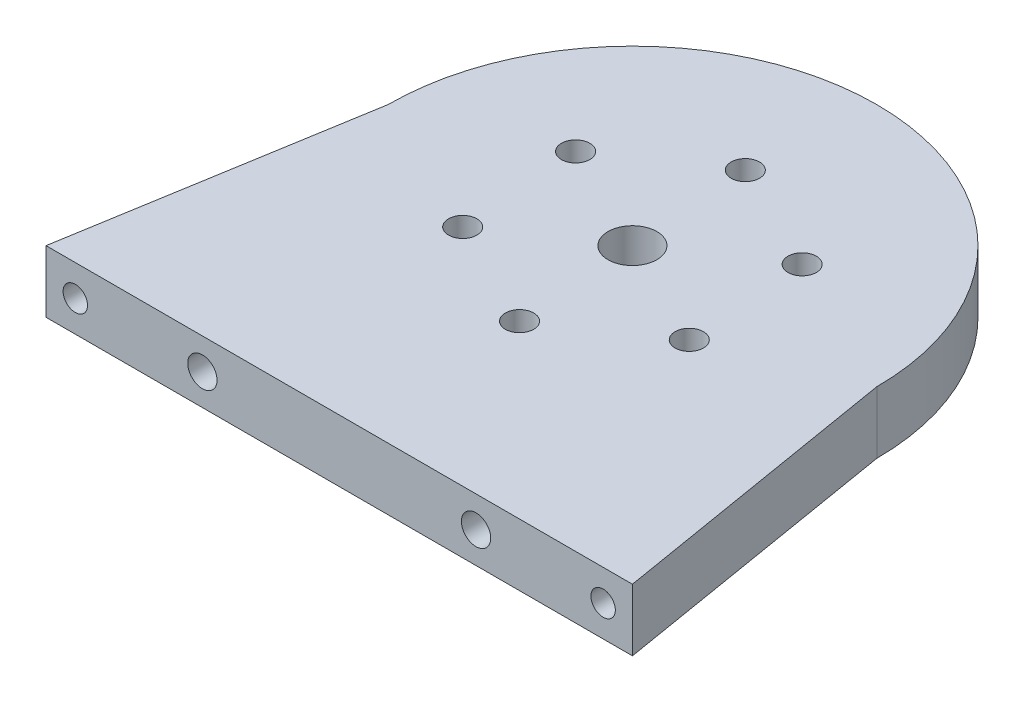
ISO-10303-21;
HEADER;
FILE_DESCRIPTION(('STEP AP214'),'2;1');
FILE_NAME('part.step','',(''),(''),'','','');
FILE_SCHEMA(('AUTOMOTIVE_DESIGN { 1 0 10303 214 1 1 1 1 }'));
ENDSEC;
DATA;
#1=APPLICATION_CONTEXT('core data for automotive mechanical design processes');
#2=APPLICATION_PROTOCOL_DEFINITION('international standard','automotive_design',2000,#1);
#3=PRODUCT_CONTEXT('',#1,'mechanical');
#4=PRODUCT('Part','Part','',(#3));
#5=PRODUCT_RELATED_PRODUCT_CATEGORY('part','',(#4));
#6=PRODUCT_DEFINITION_FORMATION('','',#4);
#7=PRODUCT_DEFINITION_CONTEXT('part definition',#1,'design');
#8=PRODUCT_DEFINITION('design','',#6,#7);
#9=PRODUCT_DEFINITION_SHAPE('','',#8);
#10=(LENGTH_UNIT() NAMED_UNIT(*) SI_UNIT(.MILLI.,.METRE.));
#11=(NAMED_UNIT(*) PLANE_ANGLE_UNIT() SI_UNIT($,.RADIAN.));
#12=(NAMED_UNIT(*) SI_UNIT($,.STERADIAN.) SOLID_ANGLE_UNIT());
#13=UNCERTAINTY_MEASURE_WITH_UNIT(LENGTH_MEASURE(1.E-05),#10,'distance_accuracy_value','');
#14=(GEOMETRIC_REPRESENTATION_CONTEXT(3) GLOBAL_UNCERTAINTY_ASSIGNED_CONTEXT((#13)) GLOBAL_UNIT_ASSIGNED_CONTEXT((#10,
#11,#12)) REPRESENTATION_CONTEXT('',''));
#15=CARTESIAN_POINT('',(0.,0.,0.));
#16=DIRECTION('',(0.,0.,1.));
#17=DIRECTION('',(1.,0.,0.));
#18=AXIS2_PLACEMENT_3D('',#15,#16,#17);
#19=CARTESIAN_POINT('',(122.4,3.175,366.55));
#20=DIRECTION('',(0.986393923832144,0.,0.164398987305357));
#21=DIRECTION('',(0.164398987305357,0.,-0.986393923832144));
#22=AXIS2_PLACEMENT_3D('',#19,#20,#21);
#23=PLANE('',#22);
#24=DIRECTION('',(-0.164398987305357,0.,0.986393923832144));
#25=VECTOR('',#24,1.);
#26=CARTESIAN_POINT('',(122.4,-3.175,366.55));
#27=LINE('',#26,#25);
#28=CARTESIAN_POINT('',(127.4,-3.175,336.55));
#29=VERTEX_POINT('',#28);
#30=CARTESIAN_POINT('',(122.4,-3.175,366.55));
#31=VERTEX_POINT('',#30);
#32=EDGE_CURVE('E115',#29,#31,#27,.T.);
#33=ORIENTED_EDGE('',*,*,#32,.T.);
#34=DIRECTION('',(0.,-1.,0.));
#35=VECTOR('',#34,1.);
#36=CARTESIAN_POINT('',(122.4,3.175,366.55));
#37=LINE('',#36,#35);
#38=CARTESIAN_POINT('',(122.4,3.175,366.55));
#39=VERTEX_POINT('',#38);
#40=EDGE_CURVE('E11',#39,#31,#37,.T.);
#41=ORIENTED_EDGE('',*,*,#40,.F.);
#42=DIRECTION('',(-0.164398987305357,0.,0.986393923832144));
#43=VECTOR('',#42,1.);
#44=CARTESIAN_POINT('',(122.4,3.175,366.55));
#45=LINE('',#44,#43);
#46=CARTESIAN_POINT('',(127.4,3.175,336.55));
#47=VERTEX_POINT('',#46);
#48=EDGE_CURVE('E65',#47,#39,#45,.T.);
#49=ORIENTED_EDGE('',*,*,#48,.F.);
#50=DIRECTION('',(0.,-1.,0.));
#51=VECTOR('',#50,1.);
#52=CARTESIAN_POINT('',(127.4,3.175,336.55));
#53=LINE('',#52,#51);
#54=EDGE_CURVE('E84',#47,#29,#53,.T.);
#55=ORIENTED_EDGE('',*,*,#54,.T.);
#56=EDGE_LOOP('',(#33,#41,#49,#55));
#57=FACE_BOUND('',#56,.T.);
#58=ADVANCED_FACE('F44',(#57),#23,.F.);
#59=CARTESIAN_POINT('',(182.4,3.175,366.55));
#60=DIRECTION('',(0.,0.,-1.));
#61=DIRECTION('',(-1.,0.,0.));
#62=AXIS2_PLACEMENT_3D('',#59,#60,#61);
#63=PLANE('',#62);
#64=CARTESIAN_POINT('',(138.4,0.,366.55));
#65=DIRECTION('',(0.,0.,1.));
#66=DIRECTION('',(1.,0.,0.));
#67=AXIS2_PLACEMENT_3D('',#64,#65,#66);
#68=CIRCLE('',#67,1.5);
#69=CARTESIAN_POINT('',(139.9,0.,366.55));
#70=VERTEX_POINT('',#69);
#71=EDGE_CURVE('E249',#70,#70,#68,.T.);
#72=ORIENTED_EDGE('',*,*,#71,.F.);
#73=EDGE_LOOP('',(#72));
#74=FACE_BOUND('',#73,.T.);
#75=CARTESIAN_POINT('',(166.4,0.,366.55));
#76=DIRECTION('',(0.,0.,1.));
#77=DIRECTION('',(1.,0.,0.));
#78=AXIS2_PLACEMENT_3D('',#75,#76,#77);
#79=CIRCLE('',#78,1.5);
#80=CARTESIAN_POINT('',(167.9,0.,366.55));
#81=VERTEX_POINT('',#80);
#82=EDGE_CURVE('E263',#81,#81,#79,.T.);
#83=ORIENTED_EDGE('',*,*,#82,.F.);
#84=EDGE_LOOP('',(#83));
#85=FACE_BOUND('',#84,.T.);
#86=CARTESIAN_POINT('',(125.4,0.,366.55));
#87=DIRECTION('',(0.,0.,1.));
#88=DIRECTION('',(1.,0.,0.));
#89=AXIS2_PLACEMENT_3D('',#86,#87,#88);
#90=CIRCLE('',#89,1.25);
#91=CARTESIAN_POINT('',(126.65,0.,366.55));
#92=VERTEX_POINT('',#91);
#93=EDGE_CURVE('E208',#92,#92,#90,.T.);
#94=ORIENTED_EDGE('',*,*,#93,.F.);
#95=EDGE_LOOP('',(#94));
#96=FACE_BOUND('',#95,.T.);
#97=CARTESIAN_POINT('',(179.4,0.,366.55));
#98=DIRECTION('',(0.,0.,1.));
#99=DIRECTION('',(1.,0.,0.));
#100=AXIS2_PLACEMENT_3D('',#97,#98,#99);
#101=CIRCLE('',#100,1.25);
#102=CARTESIAN_POINT('',(180.65,0.,366.55));
#103=VERTEX_POINT('',#102);
#104=EDGE_CURVE('E244',#103,#103,#101,.T.);
#105=ORIENTED_EDGE('',*,*,#104,.F.);
#106=EDGE_LOOP('',(#105));
#107=FACE_BOUND('',#106,.T.);
#108=DIRECTION('',(1.,0.,0.));
#109=VECTOR('',#108,1.);
#110=CARTESIAN_POINT('',(182.4,-3.175,366.55));
#111=LINE('',#110,#109);
#112=CARTESIAN_POINT('',(182.4,-3.175,366.55));
#113=VERTEX_POINT('',#112);
#114=EDGE_CURVE('E76',#31,#113,#111,.T.);
#115=ORIENTED_EDGE('',*,*,#114,.T.);
#116=DIRECTION('',(0.,-1.,0.));
#117=VECTOR('',#116,1.);
#118=CARTESIAN_POINT('',(182.4,3.175,366.55));
#119=LINE('',#118,#117);
#120=CARTESIAN_POINT('',(182.4,3.175,366.55));
#121=VERTEX_POINT('',#120);
#122=EDGE_CURVE('E54',#121,#113,#119,.T.);
#123=ORIENTED_EDGE('',*,*,#122,.F.);
#124=DIRECTION('',(1.,0.,0.));
#125=VECTOR('',#124,1.);
#126=CARTESIAN_POINT('',(182.4,3.175,366.55));
#127=LINE('',#126,#125);
#128=EDGE_CURVE('E90',#39,#121,#127,.T.);
#129=ORIENTED_EDGE('',*,*,#128,.F.);
#130=ORIENTED_EDGE('',*,*,#40,.T.);
#131=EDGE_LOOP('',(#115,#123,#129,#130));
#132=FACE_BOUND('',#131,.T.);
#133=ADVANCED_FACE('F276',(#74,#85,#96,#107,#132),#63,.F.);
#134=CARTESIAN_POINT('',(177.4,3.175,336.55));
#135=DIRECTION('',(-0.986393923832144,0.,0.164398987305357));
#136=DIRECTION('',(0.164398987305357,0.,0.986393923832144));
#137=AXIS2_PLACEMENT_3D('',#134,#135,#136);
#138=PLANE('',#137);
#139=DIRECTION('',(-0.164398987305357,0.,-0.986393923832144));
#140=VECTOR('',#139,1.);
#141=CARTESIAN_POINT('',(177.4,-3.175,336.55));
#142=LINE('',#141,#140);
#143=CARTESIAN_POINT('',(177.4,-3.175,336.55));
#144=VERTEX_POINT('',#143);
#145=EDGE_CURVE('E93',#113,#144,#142,.T.);
#146=ORIENTED_EDGE('',*,*,#145,.T.);
#147=DIRECTION('',(0.,-1.,0.));
#148=VECTOR('',#147,1.);
#149=CARTESIAN_POINT('',(177.4,3.175,336.55));
#150=LINE('',#149,#148);
#151=CARTESIAN_POINT('',(177.4,3.175,336.55));
#152=VERTEX_POINT('',#151);
#153=EDGE_CURVE('E97',#152,#144,#150,.T.);
#154=ORIENTED_EDGE('',*,*,#153,.F.);
#155=DIRECTION('',(-0.164398987305357,0.,-0.986393923832144));
#156=VECTOR('',#155,1.);
#157=CARTESIAN_POINT('',(177.4,3.175,336.55));
#158=LINE('',#157,#156);
#159=EDGE_CURVE('E129',#121,#152,#158,.T.);
#160=ORIENTED_EDGE('',*,*,#159,.F.);
#161=ORIENTED_EDGE('',*,*,#122,.T.);
#162=EDGE_LOOP('',(#146,#154,#160,#161));
#163=FACE_BOUND('',#162,.T.);
#164=ADVANCED_FACE('F94',(#163),#138,.F.);
#165=CARTESIAN_POINT('',(0.,3.175,0.));
#166=DIRECTION('',(0.,-1.,0.));
#167=DIRECTION('',(0.,0.,-1.));
#168=AXIS2_PLACEMENT_3D('',#165,#166,#167);
#169=PLANE('',#168);
#170=CARTESIAN_POINT('',(153.315477464095,3.175,349.016430965306));
#171=DIRECTION('',(0.,1.,0.));
#172=DIRECTION('',(0.,0.,1.));
#173=AXIS2_PLACEMENT_3D('',#170,#171,#172);
#174=CIRCLE('',#173,1.45000000000001);
#175=CARTESIAN_POINT('',(153.315477464095,3.175,350.466430965306));
#176=VERTEX_POINT('',#175);
#177=EDGE_CURVE('E119',#176,#176,#174,.T.);
#178=ORIENTED_EDGE('',*,*,#177,.F.);
#179=EDGE_LOOP('',(#178));
#180=FACE_BOUND('',#179,.T.);
#181=CARTESIAN_POINT('',(142.061492821568,3.175,343.576042223152));
#182=DIRECTION('',(0.,1.,0.));
#183=DIRECTION('',(0.,0.,1.));
#184=AXIS2_PLACEMENT_3D('',#181,#182,#183);
#185=CIRCLE('',#184,1.45000000000001);
#186=CARTESIAN_POINT('',(142.061492821568,3.175,345.026042223152));
#187=VERTEX_POINT('',#186);
#188=EDGE_CURVE('E177',#187,#187,#185,.T.);
#189=ORIENTED_EDGE('',*,*,#188,.F.);
#190=EDGE_LOOP('',(#189));
#191=FACE_BOUND('',#190,.T.);
#192=CARTESIAN_POINT('',(141.146015357473,3.175,331.109611257846));
#193=DIRECTION('',(0.,1.,0.));
#194=DIRECTION('',(0.,0.,1.));
#195=AXIS2_PLACEMENT_3D('',#192,#193,#194);
#196=CIRCLE('',#195,1.45000000000001);
#197=CARTESIAN_POINT('',(141.146015357473,3.175,332.559611257846));
#198=VERTEX_POINT('',#197);
#199=EDGE_CURVE('E182',#198,#198,#196,.T.);
#200=ORIENTED_EDGE('',*,*,#199,.F.);
#201=EDGE_LOOP('',(#200));
#202=FACE_BOUND('',#201,.T.);
#203=CARTESIAN_POINT('',(151.484522535905,3.175,324.083569034694));
#204=DIRECTION('',(0.,1.,0.));
#205=DIRECTION('',(0.,0.,1.));
#206=AXIS2_PLACEMENT_3D('',#203,#204,#205);
#207=CIRCLE('',#206,1.45000000000001);
#208=CARTESIAN_POINT('',(151.484522535905,3.175,325.533569034694));
#209=VERTEX_POINT('',#208);
#210=EDGE_CURVE('E190',#209,#209,#207,.T.);
#211=ORIENTED_EDGE('',*,*,#210,.F.);
#212=EDGE_LOOP('',(#211));
#213=FACE_BOUND('',#212,.T.);
#214=CARTESIAN_POINT('',(162.738507178432,3.175,329.523957776848));
#215=DIRECTION('',(0.,1.,0.));
#216=DIRECTION('',(0.,0.,1.));
#217=AXIS2_PLACEMENT_3D('',#214,#215,#216);
#218=CIRCLE('',#217,1.45000000000001);
#219=CARTESIAN_POINT('',(162.738507178432,3.175,330.973957776848));
#220=VERTEX_POINT('',#219);
#221=EDGE_CURVE('E175',#220,#220,#218,.T.);
#222=ORIENTED_EDGE('',*,*,#221,.F.);
#223=EDGE_LOOP('',(#222));
#224=FACE_BOUND('',#223,.T.);
#225=CARTESIAN_POINT('',(152.4,3.175,336.55));
#226=DIRECTION('',(0.,1.,0.));
#227=DIRECTION('',(0.,0.,1.));
#228=AXIS2_PLACEMENT_3D('',#225,#226,#227);
#229=CIRCLE('',#228,2.5);
#230=CARTESIAN_POINT('',(152.4,3.175,339.05));
#231=VERTEX_POINT('',#230);
#232=EDGE_CURVE('E163',#231,#231,#229,.T.);
#233=ORIENTED_EDGE('',*,*,#232,.F.);
#234=EDGE_LOOP('',(#233));
#235=FACE_BOUND('',#234,.T.);
#236=CARTESIAN_POINT('',(163.653984642527,3.175,341.990388742154));
#237=DIRECTION('',(0.,1.,0.));
#238=DIRECTION('',(0.,0.,1.));
#239=AXIS2_PLACEMENT_3D('',#236,#237,#238);
#240=CIRCLE('',#239,1.45000000000001);
#241=CARTESIAN_POINT('',(163.653984642527,3.175,343.440388742154));
#242=VERTEX_POINT('',#241);
#243=EDGE_CURVE('E112',#242,#242,#240,.T.);
#244=ORIENTED_EDGE('',*,*,#243,.F.);
#245=EDGE_LOOP('',(#244));
#246=FACE_BOUND('',#245,.T.);
#247=ORIENTED_EDGE('',*,*,#159,.T.);
#248=CARTESIAN_POINT('',(152.4,3.175,336.55));
#249=DIRECTION('',(0.,1.,0.));
#250=DIRECTION('',(0.,0.,1.));
#251=AXIS2_PLACEMENT_3D('',#248,#249,#250);
#252=CIRCLE('',#251,25.);
#253=EDGE_CURVE('E108',#152,#47,#252,.T.);
#254=ORIENTED_EDGE('',*,*,#253,.T.);
#255=ORIENTED_EDGE('',*,*,#48,.T.);
#256=ORIENTED_EDGE('',*,*,#128,.T.);
#257=EDGE_LOOP('',(#247,#254,#255,#256));
#258=FACE_BOUND('',#257,.T.);
#259=ADVANCED_FACE('F319',(#180,#191,#202,#213,#224,#235,#246,#258),#169,.F.);
#260=CARTESIAN_POINT('',(0.,-3.175,0.));
#261=DIRECTION('',(0.,-1.,0.));
#262=DIRECTION('',(0.,0.,-1.));
#263=AXIS2_PLACEMENT_3D('',#260,#261,#262);
#264=PLANE('',#263);
#265=CARTESIAN_POINT('',(162.738507178432,-3.175,329.523957776848));
#266=DIRECTION('',(0.,1.,0.));
#267=DIRECTION('',(0.,0.,1.));
#268=AXIS2_PLACEMENT_3D('',#265,#266,#267);
#269=CIRCLE('',#268,2.5);
#270=CARTESIAN_POINT('',(162.738507178432,-3.175,332.023957776848));
#271=VERTEX_POINT('',#270);
#272=EDGE_CURVE('E209',#271,#271,#269,.T.);
#273=ORIENTED_EDGE('',*,*,#272,.T.);
#274=EDGE_LOOP('',(#273));
#275=FACE_BOUND('',#274,.T.);
#276=CARTESIAN_POINT('',(151.484522535905,-3.175,324.083569034694));
#277=DIRECTION('',(0.,1.,0.));
#278=DIRECTION('',(0.,0.,1.));
#279=AXIS2_PLACEMENT_3D('',#276,#277,#278);
#280=CIRCLE('',#279,2.5);
#281=CARTESIAN_POINT('',(151.484522535905,-3.175,326.583569034694));
#282=VERTEX_POINT('',#281);
#283=EDGE_CURVE('E216',#282,#282,#280,.T.);
#284=ORIENTED_EDGE('',*,*,#283,.T.);
#285=EDGE_LOOP('',(#284));
#286=FACE_BOUND('',#285,.T.);
#287=CARTESIAN_POINT('',(141.146015357473,-3.175,331.109611257846));
#288=DIRECTION('',(0.,1.,0.));
#289=DIRECTION('',(0.,0.,1.));
#290=AXIS2_PLACEMENT_3D('',#287,#288,#289);
#291=CIRCLE('',#290,2.5);
#292=CARTESIAN_POINT('',(141.146015357473,-3.175,333.609611257846));
#293=VERTEX_POINT('',#292);
#294=EDGE_CURVE('E228',#293,#293,#291,.T.);
#295=ORIENTED_EDGE('',*,*,#294,.T.);
#296=EDGE_LOOP('',(#295));
#297=FACE_BOUND('',#296,.T.);
#298=CARTESIAN_POINT('',(142.061492821568,-3.175,343.576042223152));
#299=DIRECTION('',(0.,1.,0.));
#300=DIRECTION('',(0.,0.,1.));
#301=AXIS2_PLACEMENT_3D('',#298,#299,#300);
#302=CIRCLE('',#301,2.5);
#303=CARTESIAN_POINT('',(142.061492821568,-3.175,346.076042223152));
#304=VERTEX_POINT('',#303);
#305=EDGE_CURVE('E234',#304,#304,#302,.T.);
#306=ORIENTED_EDGE('',*,*,#305,.T.);
#307=EDGE_LOOP('',(#306));
#308=FACE_BOUND('',#307,.T.);
#309=CARTESIAN_POINT('',(153.315477464095,-3.175,349.016430965306));
#310=DIRECTION('',(0.,1.,0.));
#311=DIRECTION('',(0.,0.,1.));
#312=AXIS2_PLACEMENT_3D('',#309,#310,#311);
#313=CIRCLE('',#312,2.5);
#314=CARTESIAN_POINT('',(153.315477464095,-3.175,351.516430965306));
#315=VERTEX_POINT('',#314);
#316=EDGE_CURVE('E201',#315,#315,#313,.T.);
#317=ORIENTED_EDGE('',*,*,#316,.T.);
#318=EDGE_LOOP('',(#317));
#319=FACE_BOUND('',#318,.T.);
#320=CARTESIAN_POINT('',(163.653984642527,-3.175,341.990388742154));
#321=DIRECTION('',(0.,1.,0.));
#322=DIRECTION('',(0.,0.,1.));
#323=AXIS2_PLACEMENT_3D('',#320,#321,#322);
#324=CIRCLE('',#323,2.5);
#325=CARTESIAN_POINT('',(163.653984642527,-3.175,344.490388742154));
#326=VERTEX_POINT('',#325);
#327=EDGE_CURVE('E200',#326,#326,#324,.T.);
#328=ORIENTED_EDGE('',*,*,#327,.T.);
#329=EDGE_LOOP('',(#328));
#330=FACE_BOUND('',#329,.T.);
#331=CARTESIAN_POINT('',(152.4,-3.175,336.55));
#332=DIRECTION('',(0.,1.,0.));
#333=DIRECTION('',(0.,0.,1.));
#334=AXIS2_PLACEMENT_3D('',#331,#332,#333);
#335=CIRCLE('',#334,2.5);
#336=CARTESIAN_POINT('',(152.4,-3.175,339.05));
#337=VERTEX_POINT('',#336);
#338=EDGE_CURVE('E168',#337,#337,#335,.T.);
#339=ORIENTED_EDGE('',*,*,#338,.T.);
#340=EDGE_LOOP('',(#339));
#341=FACE_BOUND('',#340,.T.);
#342=ORIENTED_EDGE('',*,*,#32,.F.);
#343=CARTESIAN_POINT('',(152.4,-3.175,336.55));
#344=DIRECTION('',(0.,1.,0.));
#345=DIRECTION('',(0.,0.,1.));
#346=AXIS2_PLACEMENT_3D('',#343,#344,#345);
#347=CIRCLE('',#346,25.);
#348=EDGE_CURVE('E106',#144,#29,#347,.T.);
#349=ORIENTED_EDGE('',*,*,#348,.F.);
#350=ORIENTED_EDGE('',*,*,#145,.F.);
#351=ORIENTED_EDGE('',*,*,#114,.F.);
#352=EDGE_LOOP('',(#342,#349,#350,#351));
#353=FACE_BOUND('',#352,.T.);
#354=ADVANCED_FACE('F111',(#275,#286,#297,#308,#319,#330,#341,#353),#264,.T.);
#355=CARTESIAN_POINT('',(152.4,3.175,336.55));
#356=DIRECTION('',(0.,-1.,0.));
#357=DIRECTION('',(0.,0.,-1.));
#358=AXIS2_PLACEMENT_3D('',#355,#356,#357);
#359=CYLINDRICAL_SURFACE('',#358,25.);
#360=ORIENTED_EDGE('',*,*,#348,.T.);
#361=ORIENTED_EDGE('',*,*,#54,.F.);
#362=ORIENTED_EDGE('',*,*,#253,.F.);
#363=ORIENTED_EDGE('',*,*,#153,.T.);
#364=EDGE_LOOP('',(#360,#361,#362,#363));
#365=FACE_BOUND('',#364,.T.);
#366=ADVANCED_FACE('F102',(#365),#359,.T.);
#367=CARTESIAN_POINT('',(163.653984642527,3.175,341.990388742154));
#368=DIRECTION('',(0.,-1.,0.));
#369=DIRECTION('',(0.,0.,-1.));
#370=AXIS2_PLACEMENT_3D('',#367,#368,#369);
#371=CYLINDRICAL_SURFACE('',#370,1.45000000000001);
#372=CARTESIAN_POINT('',(163.653984642527,-0.575,341.990388742154));
#373=DIRECTION('',(0.,1.,0.));
#374=DIRECTION('',(0.,0.,1.));
#375=AXIS2_PLACEMENT_3D('',#372,#373,#374);
#376=CIRCLE('',#375,1.45000000000001);
#377=CARTESIAN_POINT('',(163.653984642527,-0.575,343.440388742154));
#378=VERTEX_POINT('',#377);
#379=EDGE_CURVE('E48',#378,#378,#376,.T.);
#380=ORIENTED_EDGE('',*,*,#379,.F.);
#381=EDGE_LOOP('',(#380));
#382=FACE_BOUND('',#381,.T.);
#383=ORIENTED_EDGE('',*,*,#243,.T.);
#384=EDGE_LOOP('',(#383));
#385=FACE_BOUND('',#384,.T.);
#386=ADVANCED_FACE('F330',(#382,#385),#371,.F.);
#387=CARTESIAN_POINT('',(152.4,3.175,336.55));
#388=DIRECTION('',(0.,-1.,0.));
#389=DIRECTION('',(0.,0.,-1.));
#390=AXIS2_PLACEMENT_3D('',#387,#388,#389);
#391=CYLINDRICAL_SURFACE('',#390,2.5);
#392=ORIENTED_EDGE('',*,*,#232,.T.);
#393=EDGE_LOOP('',(#392));
#394=FACE_BOUND('',#393,.T.);
#395=ORIENTED_EDGE('',*,*,#338,.F.);
#396=EDGE_LOOP('',(#395));
#397=FACE_BOUND('',#396,.T.);
#398=ADVANCED_FACE('F344',(#394,#397),#391,.F.);
#399=CARTESIAN_POINT('',(162.738507178432,3.175,329.523957776848));
#400=DIRECTION('',(0.,-1.,0.));
#401=DIRECTION('',(0.,0.,-1.));
#402=AXIS2_PLACEMENT_3D('',#399,#400,#401);
#403=CYLINDRICAL_SURFACE('',#402,1.45000000000001);
#404=CARTESIAN_POINT('',(162.738507178432,-0.575,329.523957776848));
#405=DIRECTION('',(0.,1.,0.));
#406=DIRECTION('',(0.,0.,1.));
#407=AXIS2_PLACEMENT_3D('',#404,#405,#406);
#408=CIRCLE('',#407,1.45000000000001);
#409=CARTESIAN_POINT('',(162.738507178432,-0.575,330.973957776848));
#410=VERTEX_POINT('',#409);
#411=EDGE_CURVE('E154',#410,#410,#408,.T.);
#412=ORIENTED_EDGE('',*,*,#411,.F.);
#413=EDGE_LOOP('',(#412));
#414=FACE_BOUND('',#413,.T.);
#415=ORIENTED_EDGE('',*,*,#221,.T.);
#416=EDGE_LOOP('',(#415));
#417=FACE_BOUND('',#416,.T.);
#418=ADVANCED_FACE('F348',(#414,#417),#403,.F.);
#419=CARTESIAN_POINT('',(151.484522535905,3.175,324.083569034694));
#420=DIRECTION('',(0.,-1.,0.));
#421=DIRECTION('',(0.,0.,-1.));
#422=AXIS2_PLACEMENT_3D('',#419,#420,#421);
#423=CYLINDRICAL_SURFACE('',#422,1.45000000000001);
#424=CARTESIAN_POINT('',(151.484522535905,-0.575,324.083569034694));
#425=DIRECTION('',(0.,1.,0.));
#426=DIRECTION('',(0.,0.,1.));
#427=AXIS2_PLACEMENT_3D('',#424,#425,#426);
#428=CIRCLE('',#427,1.45000000000001);
#429=CARTESIAN_POINT('',(151.484522535905,-0.575,325.533569034694));
#430=VERTEX_POINT('',#429);
#431=EDGE_CURVE('E153',#430,#430,#428,.T.);
#432=ORIENTED_EDGE('',*,*,#431,.F.);
#433=EDGE_LOOP('',(#432));
#434=FACE_BOUND('',#433,.T.);
#435=ORIENTED_EDGE('',*,*,#210,.T.);
#436=EDGE_LOOP('',(#435));
#437=FACE_BOUND('',#436,.T.);
#438=ADVANCED_FACE('F370',(#434,#437),#423,.F.);
#439=CARTESIAN_POINT('',(141.146015357473,3.175,331.109611257846));
#440=DIRECTION('',(0.,-1.,0.));
#441=DIRECTION('',(0.,0.,-1.));
#442=AXIS2_PLACEMENT_3D('',#439,#440,#441);
#443=CYLINDRICAL_SURFACE('',#442,1.45000000000001);
#444=CARTESIAN_POINT('',(141.146015357473,-0.575,331.109611257846));
#445=DIRECTION('',(0.,1.,0.));
#446=DIRECTION('',(0.,0.,1.));
#447=AXIS2_PLACEMENT_3D('',#444,#445,#446);
#448=CIRCLE('',#447,1.45000000000001);
#449=CARTESIAN_POINT('',(141.146015357473,-0.575,332.559611257846));
#450=VERTEX_POINT('',#449);
#451=EDGE_CURVE('E149',#450,#450,#448,.T.);
#452=ORIENTED_EDGE('',*,*,#451,.F.);
#453=EDGE_LOOP('',(#452));
#454=FACE_BOUND('',#453,.T.);
#455=ORIENTED_EDGE('',*,*,#199,.T.);
#456=EDGE_LOOP('',(#455));
#457=FACE_BOUND('',#456,.T.);
#458=ADVANCED_FACE('F376',(#454,#457),#443,.F.);
#459=CARTESIAN_POINT('',(142.061492821568,3.175,343.576042223152));
#460=DIRECTION('',(0.,-1.,0.));
#461=DIRECTION('',(0.,0.,-1.));
#462=AXIS2_PLACEMENT_3D('',#459,#460,#461);
#463=CYLINDRICAL_SURFACE('',#462,1.45000000000001);
#464=CARTESIAN_POINT('',(142.061492821568,-0.575,343.576042223152));
#465=DIRECTION('',(0.,1.,0.));
#466=DIRECTION('',(0.,0.,1.));
#467=AXIS2_PLACEMENT_3D('',#464,#465,#466);
#468=CIRCLE('',#467,1.45000000000001);
#469=CARTESIAN_POINT('',(142.061492821568,-0.575,345.026042223152));
#470=VERTEX_POINT('',#469);
#471=EDGE_CURVE('E145',#470,#470,#468,.T.);
#472=ORIENTED_EDGE('',*,*,#471,.F.);
#473=EDGE_LOOP('',(#472));
#474=FACE_BOUND('',#473,.T.);
#475=ORIENTED_EDGE('',*,*,#188,.T.);
#476=EDGE_LOOP('',(#475));
#477=FACE_BOUND('',#476,.T.);
#478=ADVANCED_FACE('F383',(#474,#477),#463,.F.);
#479=CARTESIAN_POINT('',(153.315477464095,3.175,349.016430965306));
#480=DIRECTION('',(0.,-1.,0.));
#481=DIRECTION('',(0.,0.,-1.));
#482=AXIS2_PLACEMENT_3D('',#479,#480,#481);
#483=CYLINDRICAL_SURFACE('',#482,1.45000000000001);
#484=CARTESIAN_POINT('',(153.315477464095,-0.575,349.016430965306));
#485=DIRECTION('',(0.,1.,0.));
#486=DIRECTION('',(0.,0.,1.));
#487=AXIS2_PLACEMENT_3D('',#484,#485,#486);
#488=CIRCLE('',#487,1.45000000000001);
#489=CARTESIAN_POINT('',(153.315477464095,-0.575,350.466430965306));
#490=VERTEX_POINT('',#489);
#491=EDGE_CURVE('E138',#490,#490,#488,.T.);
#492=ORIENTED_EDGE('',*,*,#491,.F.);
#493=EDGE_LOOP('',(#492));
#494=FACE_BOUND('',#493,.T.);
#495=ORIENTED_EDGE('',*,*,#177,.T.);
#496=EDGE_LOOP('',(#495));
#497=FACE_BOUND('',#496,.T.);
#498=ADVANCED_FACE('F394',(#494,#497),#483,.F.);
#499=CARTESIAN_POINT('',(153.315477464095,-0.575,349.016430965306));
#500=DIRECTION('',(0.,-1.,0.));
#501=DIRECTION('',(0.,0.,-1.));
#502=AXIS2_PLACEMENT_3D('',#499,#500,#501);
#503=CYLINDRICAL_SURFACE('',#502,2.5);
#504=CARTESIAN_POINT('',(153.315477464095,-0.575,349.016430965306));
#505=DIRECTION('',(0.,1.,0.));
#506=DIRECTION('',(0.,0.,1.));
#507=AXIS2_PLACEMENT_3D('',#504,#505,#506);
#508=CIRCLE('',#507,2.5);
#509=CARTESIAN_POINT('',(153.315477464095,-0.575,351.516430965306));
#510=VERTEX_POINT('',#509);
#511=EDGE_CURVE('E238',#510,#510,#508,.T.);
#512=ORIENTED_EDGE('',*,*,#511,.T.);
#513=EDGE_LOOP('',(#512));
#514=FACE_BOUND('',#513,.T.);
#515=ORIENTED_EDGE('',*,*,#316,.F.);
#516=EDGE_LOOP('',(#515));
#517=FACE_BOUND('',#516,.T.);
#518=ADVANCED_FACE('F401',(#514,#517),#503,.F.);
#519=CARTESIAN_POINT('',(153.315477464095,-0.575,349.016430965306));
#520=DIRECTION('',(0.,1.,0.));
#521=DIRECTION('',(0.,0.,1.));
#522=AXIS2_PLACEMENT_3D('',#519,#520,#521);
#523=PLANE('',#522);
#524=ORIENTED_EDGE('',*,*,#491,.T.);
#525=EDGE_LOOP('',(#524));
#526=FACE_BOUND('',#525,.T.);
#527=ORIENTED_EDGE('',*,*,#511,.F.);
#528=EDGE_LOOP('',(#527));
#529=FACE_BOUND('',#528,.T.);
#530=ADVANCED_FACE('F415',(#526,#529),#523,.F.);
#531=CARTESIAN_POINT('',(142.061492821568,-0.575,343.576042223152));
#532=DIRECTION('',(0.,-1.,0.));
#533=DIRECTION('',(0.,0.,-1.));
#534=AXIS2_PLACEMENT_3D('',#531,#532,#533);
#535=CYLINDRICAL_SURFACE('',#534,2.5);
#536=CARTESIAN_POINT('',(142.061492821568,-0.575,343.576042223152));
#537=DIRECTION('',(0.,1.,0.));
#538=DIRECTION('',(0.,0.,1.));
#539=AXIS2_PLACEMENT_3D('',#536,#537,#538);
#540=CIRCLE('',#539,2.5);
#541=CARTESIAN_POINT('',(142.061492821568,-0.575,346.076042223152));
#542=VERTEX_POINT('',#541);
#543=EDGE_CURVE('E229',#542,#542,#540,.T.);
#544=ORIENTED_EDGE('',*,*,#543,.T.);
#545=EDGE_LOOP('',(#544));
#546=FACE_BOUND('',#545,.T.);
#547=ORIENTED_EDGE('',*,*,#305,.F.);
#548=EDGE_LOOP('',(#547));
#549=FACE_BOUND('',#548,.T.);
#550=ADVANCED_FACE('F419',(#546,#549),#535,.F.);
#551=CARTESIAN_POINT('',(142.061492821568,-0.575,343.576042223152));
#552=DIRECTION('',(0.,1.,0.));
#553=DIRECTION('',(0.,0.,1.));
#554=AXIS2_PLACEMENT_3D('',#551,#552,#553);
#555=PLANE('',#554);
#556=ORIENTED_EDGE('',*,*,#471,.T.);
#557=EDGE_LOOP('',(#556));
#558=FACE_BOUND('',#557,.T.);
#559=ORIENTED_EDGE('',*,*,#543,.F.);
#560=EDGE_LOOP('',(#559));
#561=FACE_BOUND('',#560,.T.);
#562=ADVANCED_FACE('F429',(#558,#561),#555,.F.);
#563=CARTESIAN_POINT('',(141.146015357473,-0.575,331.109611257846));
#564=DIRECTION('',(0.,-1.,0.));
#565=DIRECTION('',(0.,0.,-1.));
#566=AXIS2_PLACEMENT_3D('',#563,#564,#565);
#567=CYLINDRICAL_SURFACE('',#566,2.5);
#568=CARTESIAN_POINT('',(141.146015357473,-0.575,331.109611257846));
#569=DIRECTION('',(0.,1.,0.));
#570=DIRECTION('',(0.,0.,1.));
#571=AXIS2_PLACEMENT_3D('',#568,#569,#570);
#572=CIRCLE('',#571,2.5);
#573=CARTESIAN_POINT('',(141.146015357473,-0.575,333.609611257846));
#574=VERTEX_POINT('',#573);
#575=EDGE_CURVE('E225',#574,#574,#572,.T.);
#576=ORIENTED_EDGE('',*,*,#575,.T.);
#577=EDGE_LOOP('',(#576));
#578=FACE_BOUND('',#577,.T.);
#579=ORIENTED_EDGE('',*,*,#294,.F.);
#580=EDGE_LOOP('',(#579));
#581=FACE_BOUND('',#580,.T.);
#582=ADVANCED_FACE('F438',(#578,#581),#567,.F.);
#583=CARTESIAN_POINT('',(141.146015357473,-0.575,331.109611257846));
#584=DIRECTION('',(0.,1.,0.));
#585=DIRECTION('',(0.,0.,1.));
#586=AXIS2_PLACEMENT_3D('',#583,#584,#585);
#587=PLANE('',#586);
#588=ORIENTED_EDGE('',*,*,#451,.T.);
#589=EDGE_LOOP('',(#588));
#590=FACE_BOUND('',#589,.T.);
#591=ORIENTED_EDGE('',*,*,#575,.F.);
#592=EDGE_LOOP('',(#591));
#593=FACE_BOUND('',#592,.T.);
#594=ADVANCED_FACE('F450',(#590,#593),#587,.F.);
#595=CARTESIAN_POINT('',(151.484522535905,-0.575,324.083569034694));
#596=DIRECTION('',(0.,-1.,0.));
#597=DIRECTION('',(0.,0.,-1.));
#598=AXIS2_PLACEMENT_3D('',#595,#596,#597);
#599=CYLINDRICAL_SURFACE('',#598,2.5);
#600=CARTESIAN_POINT('',(151.484522535905,-0.575,324.083569034694));
#601=DIRECTION('',(0.,1.,0.));
#602=DIRECTION('',(0.,0.,1.));
#603=AXIS2_PLACEMENT_3D('',#600,#601,#602);
#604=CIRCLE('',#603,2.5);
#605=CARTESIAN_POINT('',(151.484522535905,-0.575,326.583569034694));
#606=VERTEX_POINT('',#605);
#607=EDGE_CURVE('E215',#606,#606,#604,.T.);
#608=ORIENTED_EDGE('',*,*,#607,.T.);
#609=EDGE_LOOP('',(#608));
#610=FACE_BOUND('',#609,.T.);
#611=ORIENTED_EDGE('',*,*,#283,.F.);
#612=EDGE_LOOP('',(#611));
#613=FACE_BOUND('',#612,.T.);
#614=ADVANCED_FACE('F458',(#610,#613),#599,.F.);
#615=CARTESIAN_POINT('',(151.484522535905,-0.575,324.083569034694));
#616=DIRECTION('',(0.,1.,0.));
#617=DIRECTION('',(0.,0.,1.));
#618=AXIS2_PLACEMENT_3D('',#615,#616,#617);
#619=PLANE('',#618);
#620=ORIENTED_EDGE('',*,*,#431,.T.);
#621=EDGE_LOOP('',(#620));
#622=FACE_BOUND('',#621,.T.);
#623=ORIENTED_EDGE('',*,*,#607,.F.);
#624=EDGE_LOOP('',(#623));
#625=FACE_BOUND('',#624,.T.);
#626=ADVANCED_FACE('F464',(#622,#625),#619,.F.);
#627=CARTESIAN_POINT('',(162.738507178432,-0.575,329.523957776848));
#628=DIRECTION('',(0.,-1.,0.));
#629=DIRECTION('',(0.,0.,-1.));
#630=AXIS2_PLACEMENT_3D('',#627,#628,#629);
#631=CYLINDRICAL_SURFACE('',#630,2.5);
#632=CARTESIAN_POINT('',(162.738507178432,-0.575,329.523957776848));
#633=DIRECTION('',(0.,1.,0.));
#634=DIRECTION('',(0.,0.,1.));
#635=AXIS2_PLACEMENT_3D('',#632,#633,#634);
#636=CIRCLE('',#635,2.5);
#637=CARTESIAN_POINT('',(162.738507178432,-0.575,332.023957776848));
#638=VERTEX_POINT('',#637);
#639=EDGE_CURVE('E204',#638,#638,#636,.T.);
#640=ORIENTED_EDGE('',*,*,#639,.T.);
#641=EDGE_LOOP('',(#640));
#642=FACE_BOUND('',#641,.T.);
#643=ORIENTED_EDGE('',*,*,#272,.F.);
#644=EDGE_LOOP('',(#643));
#645=FACE_BOUND('',#644,.T.);
#646=ADVANCED_FACE('F475',(#642,#645),#631,.F.);
#647=CARTESIAN_POINT('',(162.738507178432,-0.575,329.523957776848));
#648=DIRECTION('',(0.,1.,0.));
#649=DIRECTION('',(0.,0.,1.));
#650=AXIS2_PLACEMENT_3D('',#647,#648,#649);
#651=PLANE('',#650);
#652=ORIENTED_EDGE('',*,*,#411,.T.);
#653=EDGE_LOOP('',(#652));
#654=FACE_BOUND('',#653,.T.);
#655=ORIENTED_EDGE('',*,*,#639,.F.);
#656=EDGE_LOOP('',(#655));
#657=FACE_BOUND('',#656,.T.);
#658=ADVANCED_FACE('F483',(#654,#657),#651,.F.);
#659=CARTESIAN_POINT('',(163.653984642527,-0.575,341.990388742154));
#660=DIRECTION('',(0.,-1.,0.));
#661=DIRECTION('',(0.,0.,-1.));
#662=AXIS2_PLACEMENT_3D('',#659,#660,#661);
#663=CYLINDRICAL_SURFACE('',#662,2.5);
#664=CARTESIAN_POINT('',(163.653984642527,-0.575,341.990388742154));
#665=DIRECTION('',(0.,1.,0.));
#666=DIRECTION('',(0.,0.,1.));
#667=AXIS2_PLACEMENT_3D('',#664,#665,#666);
#668=CIRCLE('',#667,2.5);
#669=CARTESIAN_POINT('',(163.653984642527,-0.575,344.490388742154));
#670=VERTEX_POINT('',#669);
#671=EDGE_CURVE('E141',#670,#670,#668,.T.);
#672=ORIENTED_EDGE('',*,*,#671,.T.);
#673=EDGE_LOOP('',(#672));
#674=FACE_BOUND('',#673,.T.);
#675=ORIENTED_EDGE('',*,*,#327,.F.);
#676=EDGE_LOOP('',(#675));
#677=FACE_BOUND('',#676,.T.);
#678=ADVANCED_FACE('F495',(#674,#677),#663,.F.);
#679=CARTESIAN_POINT('',(163.653984642527,-0.575,341.990388742154));
#680=DIRECTION('',(0.,1.,0.));
#681=DIRECTION('',(0.,0.,1.));
#682=AXIS2_PLACEMENT_3D('',#679,#680,#681);
#683=PLANE('',#682);
#684=ORIENTED_EDGE('',*,*,#379,.T.);
#685=EDGE_LOOP('',(#684));
#686=FACE_BOUND('',#685,.T.);
#687=ORIENTED_EDGE('',*,*,#671,.F.);
#688=EDGE_LOOP('',(#687));
#689=FACE_BOUND('',#688,.T.);
#690=ADVANCED_FACE('F291',(#686,#689),#683,.F.);
#691=CARTESIAN_POINT('',(179.4,0.,366.55));
#692=DIRECTION('',(0.,0.,-1.));
#693=DIRECTION('',(-1.,0.,0.));
#694=AXIS2_PLACEMENT_3D('',#691,#692,#693);
#695=CYLINDRICAL_SURFACE('',#694,1.25);
#696=ORIENTED_EDGE('',*,*,#104,.T.);
#697=EDGE_LOOP('',(#696));
#698=FACE_BOUND('',#697,.T.);
#699=CARTESIAN_POINT('',(179.4,0.,357.55));
#700=DIRECTION('',(0.,0.,1.));
#701=DIRECTION('',(1.,0.,0.));
#702=AXIS2_PLACEMENT_3D('',#699,#700,#701);
#703=CIRCLE('',#702,1.25);
#704=CARTESIAN_POINT('',(180.65,0.,357.55));
#705=VERTEX_POINT('',#704);
#706=EDGE_CURVE('E248',#705,#705,#703,.T.);
#707=ORIENTED_EDGE('',*,*,#706,.F.);
#708=EDGE_LOOP('',(#707));
#709=FACE_BOUND('',#708,.T.);
#710=ADVANCED_FACE('F287',(#698,#709),#695,.F.);
#711=CARTESIAN_POINT('',(179.4,0.,357.55));
#712=DIRECTION('',(0.,0.,1.));
#713=DIRECTION('',(1.,0.,0.));
#714=AXIS2_PLACEMENT_3D('',#711,#712,#713);
#715=PLANE('',#714);
#716=ORIENTED_EDGE('',*,*,#706,.T.);
#717=EDGE_LOOP('',(#716));
#718=FACE_BOUND('',#717,.T.);
#719=ADVANCED_FACE('F292',(#718),#715,.T.);
#720=CARTESIAN_POINT('',(125.4,0.,366.55));
#721=DIRECTION('',(0.,0.,-1.));
#722=DIRECTION('',(-1.,0.,0.));
#723=AXIS2_PLACEMENT_3D('',#720,#721,#722);
#724=CYLINDRICAL_SURFACE('',#723,1.25);
#725=ORIENTED_EDGE('',*,*,#93,.T.);
#726=EDGE_LOOP('',(#725));
#727=FACE_BOUND('',#726,.T.);
#728=CARTESIAN_POINT('',(125.4,0.,357.55));
#729=DIRECTION('',(0.,0.,1.));
#730=DIRECTION('',(1.,0.,0.));
#731=AXIS2_PLACEMENT_3D('',#728,#729,#730);
#732=CIRCLE('',#731,1.25);
#733=CARTESIAN_POINT('',(126.65,0.,357.55));
#734=VERTEX_POINT('',#733);
#735=EDGE_CURVE('E251',#734,#734,#732,.T.);
#736=ORIENTED_EDGE('',*,*,#735,.F.);
#737=EDGE_LOOP('',(#736));
#738=FACE_BOUND('',#737,.T.);
#739=ADVANCED_FACE('F296',(#727,#738),#724,.F.);
#740=CARTESIAN_POINT('',(125.4,0.,357.55));
#741=DIRECTION('',(0.,0.,1.));
#742=DIRECTION('',(1.,0.,0.));
#743=AXIS2_PLACEMENT_3D('',#740,#741,#742);
#744=PLANE('',#743);
#745=ORIENTED_EDGE('',*,*,#735,.T.);
#746=EDGE_LOOP('',(#745));
#747=FACE_BOUND('',#746,.T.);
#748=ADVANCED_FACE('F303',(#747),#744,.T.);
#749=CARTESIAN_POINT('',(166.4,0.,366.55));
#750=DIRECTION('',(0.,0.,-1.));
#751=DIRECTION('',(-1.,0.,0.));
#752=AXIS2_PLACEMENT_3D('',#749,#750,#751);
#753=CYLINDRICAL_SURFACE('',#752,1.5);
#754=ORIENTED_EDGE('',*,*,#82,.T.);
#755=EDGE_LOOP('',(#754));
#756=FACE_BOUND('',#755,.T.);
#757=CARTESIAN_POINT('',(166.4,0.,359.55));
#758=DIRECTION('',(0.,0.,1.));
#759=DIRECTION('',(1.,0.,0.));
#760=AXIS2_PLACEMENT_3D('',#757,#758,#759);
#761=CIRCLE('',#760,1.5);
#762=CARTESIAN_POINT('',(167.9,0.,359.55));
#763=VERTEX_POINT('',#762);
#764=EDGE_CURVE('E262',#763,#763,#761,.T.);
#765=ORIENTED_EDGE('',*,*,#764,.F.);
#766=EDGE_LOOP('',(#765));
#767=FACE_BOUND('',#766,.T.);
#768=ADVANCED_FACE('F531',(#756,#767),#753,.F.);
#769=CARTESIAN_POINT('',(166.4,0.,359.55));
#770=DIRECTION('',(0.,0.,1.));
#771=DIRECTION('',(1.,0.,0.));
#772=AXIS2_PLACEMENT_3D('',#769,#770,#771);
#773=PLANE('',#772);
#774=ORIENTED_EDGE('',*,*,#764,.T.);
#775=EDGE_LOOP('',(#774));
#776=FACE_BOUND('',#775,.T.);
#777=ADVANCED_FACE('F541',(#776),#773,.T.);
#778=CARTESIAN_POINT('',(138.4,0.,366.55));
#779=DIRECTION('',(0.,0.,-1.));
#780=DIRECTION('',(-1.,0.,0.));
#781=AXIS2_PLACEMENT_3D('',#778,#779,#780);
#782=CYLINDRICAL_SURFACE('',#781,1.5);
#783=ORIENTED_EDGE('',*,*,#71,.T.);
#784=EDGE_LOOP('',(#783));
#785=FACE_BOUND('',#784,.T.);
#786=CARTESIAN_POINT('',(138.4,0.,359.55));
#787=DIRECTION('',(0.,0.,1.));
#788=DIRECTION('',(1.,0.,0.));
#789=AXIS2_PLACEMENT_3D('',#786,#787,#788);
#790=CIRCLE('',#789,1.5);
#791=CARTESIAN_POINT('',(139.9,0.,359.55));
#792=VERTEX_POINT('',#791);
#793=EDGE_CURVE('E267',#792,#792,#790,.T.);
#794=ORIENTED_EDGE('',*,*,#793,.F.);
#795=EDGE_LOOP('',(#794));
#796=FACE_BOUND('',#795,.T.);
#797=ADVANCED_FACE('F279',(#785,#796),#782,.F.);
#798=CARTESIAN_POINT('',(138.4,0.,359.55));
#799=DIRECTION('',(0.,0.,1.));
#800=DIRECTION('',(1.,0.,0.));
#801=AXIS2_PLACEMENT_3D('',#798,#799,#800);
#802=PLANE('',#801);
#803=ORIENTED_EDGE('',*,*,#793,.T.);
#804=EDGE_LOOP('',(#803));
#805=FACE_BOUND('',#804,.T.);
#806=ADVANCED_FACE('F565',(#805),#802,.T.);
#807=CLOSED_SHELL('',(#58,#133,#164,#259,#354,#366,#386,#398,#418,#438,#458,#478,#498,#518,#530,
#550,#562,#582,#594,#614,#626,#646,#658,#678,#690,#710,#719,#739,#748,#768,#777,#797,#806));
#808=MANIFOLD_SOLID_BREP('B2',#807);
#809=ADVANCED_BREP_SHAPE_REPRESENTATION('',(#18,#808),#14);
#810=SHAPE_DEFINITION_REPRESENTATION(#9,#809);
ENDSEC;
END-ISO-10303-21;
